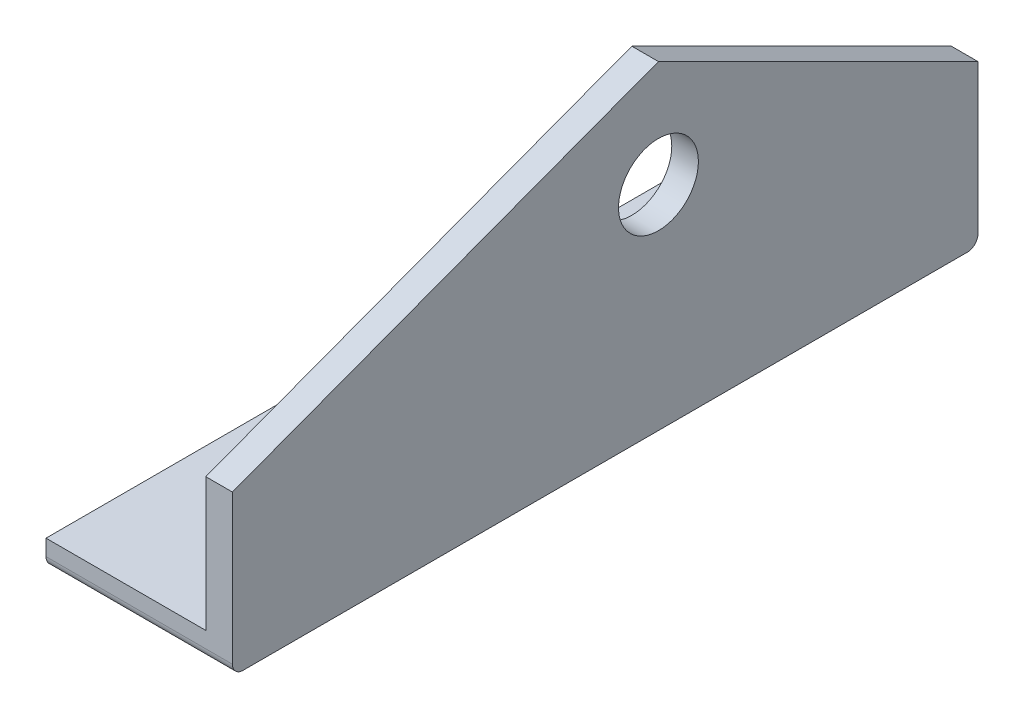
ISO-10303-21;
HEADER;
FILE_DESCRIPTION(('STEP AP214'),'2;1');
FILE_NAME('part.step','',(''),(''),'','','');
FILE_SCHEMA(('AUTOMOTIVE_DESIGN { 1 0 10303 214 1 1 1 1 }'));
ENDSEC;
DATA;
#1=APPLICATION_CONTEXT('core data for automotive mechanical design processes');
#2=APPLICATION_PROTOCOL_DEFINITION('international standard','automotive_design',2000,#1);
#3=PRODUCT_CONTEXT('',#1,'mechanical');
#4=PRODUCT('Part','Part','',(#3));
#5=PRODUCT_RELATED_PRODUCT_CATEGORY('part','',(#4));
#6=PRODUCT_DEFINITION_FORMATION('','',#4);
#7=PRODUCT_DEFINITION_CONTEXT('part definition',#1,'design');
#8=PRODUCT_DEFINITION('design','',#6,#7);
#9=PRODUCT_DEFINITION_SHAPE('','',#8);
#10=(LENGTH_UNIT() NAMED_UNIT(*) SI_UNIT(.MILLI.,.METRE.));
#11=(NAMED_UNIT(*) PLANE_ANGLE_UNIT() SI_UNIT($,.RADIAN.));
#12=(NAMED_UNIT(*) SI_UNIT($,.STERADIAN.) SOLID_ANGLE_UNIT());
#13=UNCERTAINTY_MEASURE_WITH_UNIT(LENGTH_MEASURE(1.E-05),#10,'distance_accuracy_value','');
#14=(GEOMETRIC_REPRESENTATION_CONTEXT(3) GLOBAL_UNCERTAINTY_ASSIGNED_CONTEXT((#13)) GLOBAL_UNIT_ASSIGNED_CONTEXT((#10,
#11,#12)) REPRESENTATION_CONTEXT('',''));
#15=CARTESIAN_POINT('',(0.,0.,0.));
#16=DIRECTION('',(0.,0.,1.));
#17=DIRECTION('',(1.,0.,0.));
#18=AXIS2_PLACEMENT_3D('',#15,#16,#17);
#19=CARTESIAN_POINT('',(0.,0.,0.));
#20=DIRECTION('',(1.,0.,0.));
#21=DIRECTION('',(0.,0.,-1.));
#22=AXIS2_PLACEMENT_3D('',#19,#20,#21);
#23=PLANE('',#22);
#24=CARTESIAN_POINT('',(0.,0.,0.));
#25=DIRECTION('',(1.,0.,0.));
#26=DIRECTION('',(0.,0.,-1.));
#27=AXIS2_PLACEMENT_3D('',#24,#25,#26);
#28=CIRCLE('',#27,7.5);
#29=CARTESIAN_POINT('',(0.,0.,-7.5));
#30=VERTEX_POINT('',#29);
#31=EDGE_CURVE('E141',#30,#30,#28,.T.);
#32=ORIENTED_EDGE('',*,*,#31,.T.);
#33=EDGE_LOOP('',(#32));
#34=FACE_BOUND('',#33,.T.);
#35=DIRECTION('',(0.,0.,-1.));
#36=VECTOR('',#35,1.);
#37=CARTESIAN_POINT('',(0.,-35.,0.));
#38=LINE('',#37,#36);
#39=CARTESIAN_POINT('',(0.,-35.,80.));
#40=VERTEX_POINT('',#39);
#41=CARTESIAN_POINT('',(0.,-35.,-60.));
#42=VERTEX_POINT('',#41);
#43=EDGE_CURVE('E137',#40,#42,#38,.T.);
#44=ORIENTED_EDGE('',*,*,#43,.F.);
#45=DIRECTION('',(0.,-1.,0.));
#46=VECTOR('',#45,1.);
#47=CARTESIAN_POINT('',(0.,-10.,80.));
#48=LINE('',#47,#46);
#49=CARTESIAN_POINT('',(0.,-10.,80.));
#50=VERTEX_POINT('',#49);
#51=EDGE_CURVE('E135',#50,#40,#48,.T.);
#52=ORIENTED_EDGE('',*,*,#51,.F.);
#53=DIRECTION('',(0.,-0.351123441588392,0.936329177569045));
#54=VECTOR('',#53,1.);
#55=CARTESIAN_POINT('',(0.,20.,0.));
#56=LINE('',#55,#54);
#57=CARTESIAN_POINT('',(0.,20.,0.));
#58=VERTEX_POINT('',#57);
#59=EDGE_CURVE('E176',#58,#50,#56,.T.);
#60=ORIENTED_EDGE('',*,*,#59,.F.);
#61=DIRECTION('',(0.,0.447213595499958,0.894427190999916));
#62=VECTOR('',#61,1.);
#63=CARTESIAN_POINT('',(0.,-10.,-60.));
#64=LINE('',#63,#62);
#65=CARTESIAN_POINT('',(0.,-10.,-60.));
#66=VERTEX_POINT('',#65);
#67=EDGE_CURVE('E151',#66,#58,#64,.T.);
#68=ORIENTED_EDGE('',*,*,#67,.F.);
#69=DIRECTION('',(0.,1.,0.));
#70=VECTOR('',#69,1.);
#71=CARTESIAN_POINT('',(0.,-40.,-60.));
#72=LINE('',#71,#70);
#73=EDGE_CURVE('E160',#42,#66,#72,.T.);
#74=ORIENTED_EDGE('',*,*,#73,.F.);
#75=EDGE_LOOP('',(#44,#52,#60,#68,#74));
#76=FACE_BOUND('',#75,.T.);
#77=ADVANCED_FACE('F38',(#34,#76),#23,.F.);
#78=CARTESIAN_POINT('',(5.,0.,0.));
#79=DIRECTION('',(1.,0.,0.));
#80=DIRECTION('',(0.,0.,-1.));
#81=AXIS2_PLACEMENT_3D('',#78,#79,#80);
#82=PLANE('',#81);
#83=DIRECTION('',(0.,0.,-1.));
#84=VECTOR('',#83,1.);
#85=CARTESIAN_POINT('',(5.,-40.,80.));
#86=LINE('',#85,#84);
#87=CARTESIAN_POINT('',(5.,-40.,78.));
#88=VERTEX_POINT('',#87);
#89=CARTESIAN_POINT('',(5.,-40.,-58.));
#90=VERTEX_POINT('',#89);
#91=EDGE_CURVE('E166',#88,#90,#86,.T.);
#92=ORIENTED_EDGE('',*,*,#91,.T.);
#93=CARTESIAN_POINT('',(5.,-38.,-58.));
#94=DIRECTION('',(1.,0.,0.));
#95=DIRECTION('',(0.,0.,-1.));
#96=AXIS2_PLACEMENT_3D('',#93,#94,#95);
#97=CIRCLE('',#96,2.);
#98=CARTESIAN_POINT('',(5.,-38.,-60.));
#99=VERTEX_POINT('',#98);
#100=EDGE_CURVE('E47',#90,#99,#97,.T.);
#101=ORIENTED_EDGE('',*,*,#100,.T.);
#102=DIRECTION('',(0.,1.,0.));
#103=VECTOR('',#102,1.);
#104=CARTESIAN_POINT('',(5.,-40.,-60.));
#105=LINE('',#104,#103);
#106=CARTESIAN_POINT('',(5.,-10.,-60.));
#107=VERTEX_POINT('',#106);
#108=EDGE_CURVE('E169',#99,#107,#105,.T.);
#109=ORIENTED_EDGE('',*,*,#108,.T.);
#110=DIRECTION('',(0.,0.447213595499958,0.894427190999916));
#111=VECTOR('',#110,1.);
#112=CARTESIAN_POINT('',(5.,-10.,-60.));
#113=LINE('',#112,#111);
#114=CARTESIAN_POINT('',(5.,20.,0.));
#115=VERTEX_POINT('',#114);
#116=EDGE_CURVE('E155',#107,#115,#113,.T.);
#117=ORIENTED_EDGE('',*,*,#116,.T.);
#118=DIRECTION('',(0.,-0.351123441588392,0.936329177569045));
#119=VECTOR('',#118,1.);
#120=CARTESIAN_POINT('',(5.,20.,0.));
#121=LINE('',#120,#119);
#122=CARTESIAN_POINT('',(5.,-10.,80.));
#123=VERTEX_POINT('',#122);
#124=EDGE_CURVE('E159',#115,#123,#121,.T.);
#125=ORIENTED_EDGE('',*,*,#124,.T.);
#126=DIRECTION('',(0.,-1.,0.));
#127=VECTOR('',#126,1.);
#128=CARTESIAN_POINT('',(5.,-10.,80.));
#129=LINE('',#128,#127);
#130=CARTESIAN_POINT('',(5.,-38.,80.));
#131=VERTEX_POINT('',#130);
#132=EDGE_CURVE('E163',#123,#131,#129,.T.);
#133=ORIENTED_EDGE('',*,*,#132,.T.);
#134=CARTESIAN_POINT('',(5.,-38.,78.));
#135=DIRECTION('',(1.,0.,0.));
#136=DIRECTION('',(0.,0.,-1.));
#137=AXIS2_PLACEMENT_3D('',#134,#135,#136);
#138=CIRCLE('',#137,2.);
#139=EDGE_CURVE('E208',#131,#88,#138,.T.);
#140=ORIENTED_EDGE('',*,*,#139,.T.);
#141=EDGE_LOOP('',(#92,#101,#109,#117,#125,#133,#140));
#142=FACE_BOUND('',#141,.T.);
#143=CARTESIAN_POINT('',(5.,0.,0.));
#144=DIRECTION('',(1.,0.,0.));
#145=DIRECTION('',(0.,0.,-1.));
#146=AXIS2_PLACEMENT_3D('',#143,#144,#145);
#147=CIRCLE('',#146,7.5);
#148=CARTESIAN_POINT('',(5.,0.,-7.5));
#149=VERTEX_POINT('',#148);
#150=EDGE_CURVE('E147',#149,#149,#147,.T.);
#151=ORIENTED_EDGE('',*,*,#150,.F.);
#152=EDGE_LOOP('',(#151));
#153=FACE_BOUND('',#152,.T.);
#154=ADVANCED_FACE('F214',(#142,#153),#82,.T.);
#155=CARTESIAN_POINT('',(5.,-10.,-60.));
#156=DIRECTION('',(0.,-0.894427190999916,0.447213595499958));
#157=DIRECTION('',(0.,-0.447213595499958,-0.894427190999916));
#158=AXIS2_PLACEMENT_3D('',#155,#156,#157);
#159=PLANE('',#158);
#160=ORIENTED_EDGE('',*,*,#67,.T.);
#161=DIRECTION('',(-1.,0.,0.));
#162=VECTOR('',#161,1.);
#163=CARTESIAN_POINT('',(5.,20.,0.));
#164=LINE('',#163,#162);
#165=EDGE_CURVE('E189',#115,#58,#164,.T.);
#166=ORIENTED_EDGE('',*,*,#165,.F.);
#167=ORIENTED_EDGE('',*,*,#116,.F.);
#168=DIRECTION('',(-1.,0.,0.));
#169=VECTOR('',#168,1.);
#170=CARTESIAN_POINT('',(5.,-10.,-60.));
#171=LINE('',#170,#169);
#172=EDGE_CURVE('E172',#107,#66,#171,.T.);
#173=ORIENTED_EDGE('',*,*,#172,.T.);
#174=EDGE_LOOP('',(#160,#166,#167,#173));
#175=FACE_BOUND('',#174,.T.);
#176=ADVANCED_FACE('F233',(#175),#159,.F.);
#177=CARTESIAN_POINT('',(5.,20.,0.));
#178=DIRECTION('',(0.,-0.936329177569045,-0.351123441588392));
#179=DIRECTION('',(0.,0.351123441588392,-0.936329177569045));
#180=AXIS2_PLACEMENT_3D('',#177,#178,#179);
#181=PLANE('',#180);
#182=ORIENTED_EDGE('',*,*,#59,.T.);
#183=DIRECTION('',(-1.,0.,0.));
#184=VECTOR('',#183,1.);
#185=CARTESIAN_POINT('',(5.,-10.,80.));
#186=LINE('',#185,#184);
#187=EDGE_CURVE('E186',#123,#50,#186,.T.);
#188=ORIENTED_EDGE('',*,*,#187,.F.);
#189=ORIENTED_EDGE('',*,*,#124,.F.);
#190=ORIENTED_EDGE('',*,*,#165,.T.);
#191=EDGE_LOOP('',(#182,#188,#189,#190));
#192=FACE_BOUND('',#191,.T.);
#193=ADVANCED_FACE('F237',(#192),#181,.F.);
#194=CARTESIAN_POINT('',(5.,-10.,80.));
#195=DIRECTION('',(0.,0.,-1.));
#196=DIRECTION('',(0.,1.,0.));
#197=AXIS2_PLACEMENT_3D('',#194,#195,#196);
#198=PLANE('',#197);
#199=DIRECTION('',(0.,1.,0.));
#200=VECTOR('',#199,1.);
#201=CARTESIAN_POINT('',(-30.,-40.,80.));
#202=LINE('',#201,#200);
#203=CARTESIAN_POINT('',(-30.,-38.,80.));
#204=VERTEX_POINT('',#203);
#205=CARTESIAN_POINT('',(-30.,-35.,80.));
#206=VERTEX_POINT('',#205);
#207=EDGE_CURVE('E111',#204,#206,#202,.T.);
#208=ORIENTED_EDGE('',*,*,#207,.F.);
#209=DIRECTION('',(-1.,0.,0.));
#210=VECTOR('',#209,1.);
#211=CARTESIAN_POINT('',(5.,-38.,80.));
#212=LINE('',#211,#210);
#213=EDGE_CURVE('E11',#204,#131,#212,.F.);
#214=ORIENTED_EDGE('',*,*,#213,.T.);
#215=ORIENTED_EDGE('',*,*,#132,.F.);
#216=ORIENTED_EDGE('',*,*,#187,.T.);
#217=ORIENTED_EDGE('',*,*,#51,.T.);
#218=DIRECTION('',(1.,0.,0.));
#219=VECTOR('',#218,1.);
#220=CARTESIAN_POINT('',(-30.,-35.,80.));
#221=LINE('',#220,#219);
#222=EDGE_CURVE('E124',#206,#40,#221,.T.);
#223=ORIENTED_EDGE('',*,*,#222,.F.);
#224=EDGE_LOOP('',(#208,#214,#215,#216,#217,#223));
#225=FACE_BOUND('',#224,.T.);
#226=ADVANCED_FACE('F132',(#225),#198,.F.);
#227=CARTESIAN_POINT('',(5.,-40.,80.));
#228=DIRECTION('',(0.,1.,0.));
#229=DIRECTION('',(0.,0.,1.));
#230=AXIS2_PLACEMENT_3D('',#227,#228,#229);
#231=PLANE('',#230);
#232=DIRECTION('',(0.,0.,-1.));
#233=VECTOR('',#232,1.);
#234=CARTESIAN_POINT('',(-30.,-40.,80.));
#235=LINE('',#234,#233);
#236=CARTESIAN_POINT('',(-30.,-40.,78.));
#237=VERTEX_POINT('',#236);
#238=CARTESIAN_POINT('',(-30.,-40.,-58.));
#239=VERTEX_POINT('',#238);
#240=EDGE_CURVE('E143',#237,#239,#235,.T.);
#241=ORIENTED_EDGE('',*,*,#240,.T.);
#242=DIRECTION('',(-1.,0.,0.));
#243=VECTOR('',#242,1.);
#244=CARTESIAN_POINT('',(5.,-40.,-58.));
#245=LINE('',#244,#243);
#246=EDGE_CURVE('E60',#239,#90,#245,.F.);
#247=ORIENTED_EDGE('',*,*,#246,.T.);
#248=ORIENTED_EDGE('',*,*,#91,.F.);
#249=DIRECTION('',(-1.,0.,0.));
#250=VECTOR('',#249,1.);
#251=CARTESIAN_POINT('',(5.,-40.,78.));
#252=LINE('',#251,#250);
#253=EDGE_CURVE('E202',#88,#237,#252,.T.);
#254=ORIENTED_EDGE('',*,*,#253,.T.);
#255=EDGE_LOOP('',(#241,#247,#248,#254));
#256=FACE_BOUND('',#255,.T.);
#257=ADVANCED_FACE('F223',(#256),#231,.F.);
#258=CARTESIAN_POINT('',(5.,-40.,-60.));
#259=DIRECTION('',(0.,0.,1.));
#260=DIRECTION('',(0.,-1.,0.));
#261=AXIS2_PLACEMENT_3D('',#258,#259,#260);
#262=PLANE('',#261);
#263=ORIENTED_EDGE('',*,*,#108,.F.);
#264=DIRECTION('',(-1.,0.,0.));
#265=VECTOR('',#264,1.);
#266=CARTESIAN_POINT('',(5.,-38.,-60.));
#267=LINE('',#266,#265);
#268=CARTESIAN_POINT('',(-30.,-38.,-60.));
#269=VERTEX_POINT('',#268);
#270=EDGE_CURVE('E193',#99,#269,#267,.T.);
#271=ORIENTED_EDGE('',*,*,#270,.T.);
#272=DIRECTION('',(0.,1.,0.));
#273=VECTOR('',#272,1.);
#274=CARTESIAN_POINT('',(-30.,-40.,-60.));
#275=LINE('',#274,#273);
#276=CARTESIAN_POINT('',(-30.,-35.,-60.));
#277=VERTEX_POINT('',#276);
#278=EDGE_CURVE('E129',#269,#277,#275,.T.);
#279=ORIENTED_EDGE('',*,*,#278,.T.);
#280=DIRECTION('',(1.,0.,0.));
#281=VECTOR('',#280,1.);
#282=CARTESIAN_POINT('',(-30.,-35.,-60.));
#283=LINE('',#282,#281);
#284=EDGE_CURVE('E127',#277,#42,#283,.T.);
#285=ORIENTED_EDGE('',*,*,#284,.T.);
#286=ORIENTED_EDGE('',*,*,#73,.T.);
#287=ORIENTED_EDGE('',*,*,#172,.F.);
#288=EDGE_LOOP('',(#263,#271,#279,#285,#286,#287));
#289=FACE_BOUND('',#288,.T.);
#290=ADVANCED_FACE('F220',(#289),#262,.F.);
#291=CARTESIAN_POINT('',(5.,0.,0.));
#292=DIRECTION('',(-1.,0.,0.));
#293=DIRECTION('',(0.,0.,1.));
#294=AXIS2_PLACEMENT_3D('',#291,#292,#293);
#295=CYLINDRICAL_SURFACE('',#294,7.5);
#296=ORIENTED_EDGE('',*,*,#150,.T.);
#297=EDGE_LOOP('',(#296));
#298=FACE_BOUND('',#297,.T.);
#299=ORIENTED_EDGE('',*,*,#31,.F.);
#300=EDGE_LOOP('',(#299));
#301=FACE_BOUND('',#300,.T.);
#302=ADVANCED_FACE('F259',(#298,#301),#295,.F.);
#303=CARTESIAN_POINT('',(-30.,-35.,80.));
#304=DIRECTION('',(0.,-1.,0.));
#305=DIRECTION('',(0.,0.,-1.));
#306=AXIS2_PLACEMENT_3D('',#303,#304,#305);
#307=PLANE('',#306);
#308=ORIENTED_EDGE('',*,*,#222,.T.);
#309=ORIENTED_EDGE('',*,*,#43,.T.);
#310=ORIENTED_EDGE('',*,*,#284,.F.);
#311=DIRECTION('',(0.,0.,-1.));
#312=VECTOR('',#311,1.);
#313=CARTESIAN_POINT('',(-30.,-35.,80.));
#314=LINE('',#313,#312);
#315=EDGE_CURVE('E115',#206,#277,#314,.T.);
#316=ORIENTED_EDGE('',*,*,#315,.F.);
#317=EDGE_LOOP('',(#308,#309,#310,#316));
#318=FACE_BOUND('',#317,.T.);
#319=ADVANCED_FACE('F123',(#318),#307,.F.);
#320=CARTESIAN_POINT('',(-30.,0.,0.));
#321=DIRECTION('',(-1.,0.,0.));
#322=DIRECTION('',(0.,0.,1.));
#323=AXIS2_PLACEMENT_3D('',#320,#321,#322);
#324=PLANE('',#323);
#325=ORIENTED_EDGE('',*,*,#278,.F.);
#326=CARTESIAN_POINT('',(-30.,-38.,-58.));
#327=DIRECTION('',(-1.,0.,0.));
#328=DIRECTION('',(0.,0.,1.));
#329=AXIS2_PLACEMENT_3D('',#326,#327,#328);
#330=CIRCLE('',#329,2.);
#331=EDGE_CURVE('E199',#269,#239,#330,.T.);
#332=ORIENTED_EDGE('',*,*,#331,.T.);
#333=ORIENTED_EDGE('',*,*,#240,.F.);
#334=CARTESIAN_POINT('',(-30.,-38.,78.));
#335=DIRECTION('',(-1.,0.,0.));
#336=DIRECTION('',(0.,0.,1.));
#337=AXIS2_PLACEMENT_3D('',#334,#335,#336);
#338=CIRCLE('',#337,2.);
#339=EDGE_CURVE('E118',#237,#204,#338,.T.);
#340=ORIENTED_EDGE('',*,*,#339,.T.);
#341=ORIENTED_EDGE('',*,*,#207,.T.);
#342=ORIENTED_EDGE('',*,*,#315,.T.);
#343=EDGE_LOOP('',(#325,#332,#333,#340,#341,#342));
#344=FACE_BOUND('',#343,.T.);
#345=ADVANCED_FACE('F114',(#344),#324,.T.);
#346=CARTESIAN_POINT('',(5.,-38.,-58.));
#347=DIRECTION('',(-1.,0.,0.));
#348=DIRECTION('',(0.,0.,1.));
#349=AXIS2_PLACEMENT_3D('',#346,#347,#348);
#350=CYLINDRICAL_SURFACE('',#349,2.);
#351=ORIENTED_EDGE('',*,*,#100,.F.);
#352=ORIENTED_EDGE('',*,*,#246,.F.);
#353=ORIENTED_EDGE('',*,*,#331,.F.);
#354=ORIENTED_EDGE('',*,*,#270,.F.);
#355=EDGE_LOOP('',(#351,#352,#353,#354));
#356=FACE_BOUND('',#355,.T.);
#357=ADVANCED_FACE('F222',(#356),#350,.T.);
#358=CARTESIAN_POINT('',(5.,-38.,78.));
#359=DIRECTION('',(-1.,0.,0.));
#360=DIRECTION('',(0.,0.,1.));
#361=AXIS2_PLACEMENT_3D('',#358,#359,#360);
#362=CYLINDRICAL_SURFACE('',#361,2.);
#363=ORIENTED_EDGE('',*,*,#139,.F.);
#364=ORIENTED_EDGE('',*,*,#213,.F.);
#365=ORIENTED_EDGE('',*,*,#339,.F.);
#366=ORIENTED_EDGE('',*,*,#253,.F.);
#367=EDGE_LOOP('',(#363,#364,#365,#366));
#368=FACE_BOUND('',#367,.T.);
#369=ADVANCED_FACE('F40',(#368),#362,.T.);
#370=CLOSED_SHELL('',(#77,#154,#176,#193,#226,#257,#290,#302,#319,#345,#357,#369));
#371=MANIFOLD_SOLID_BREP('B2',#370);
#372=ADVANCED_BREP_SHAPE_REPRESENTATION('',(#18,#371),#14);
#373=SHAPE_DEFINITION_REPRESENTATION(#9,#372);
ENDSEC;
END-ISO-10303-21;
